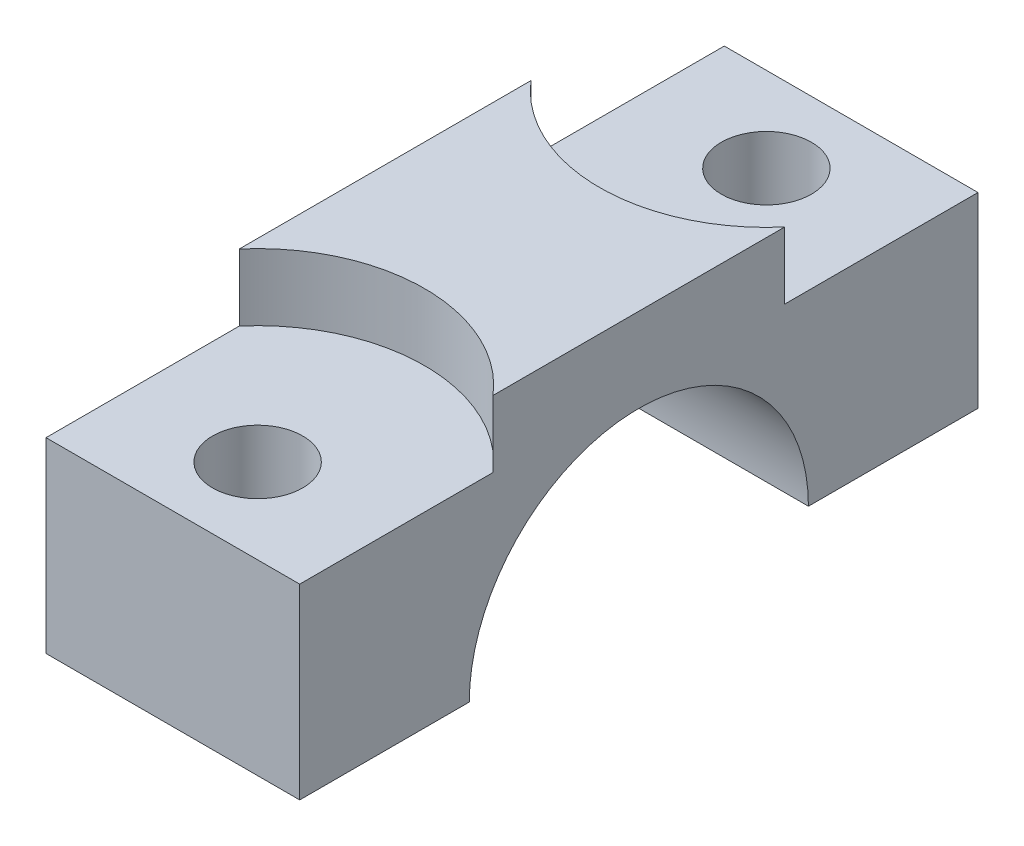
ISO-10303-21;
HEADER;
FILE_DESCRIPTION(('STEP AP214'),'2;1');
FILE_NAME('part.step','',(''),(''),'','','');
FILE_SCHEMA(('AUTOMOTIVE_DESIGN { 1 0 10303 214 1 1 1 1 }'));
ENDSEC;
DATA;
#1=APPLICATION_CONTEXT('core data for automotive mechanical design processes');
#2=APPLICATION_PROTOCOL_DEFINITION('international standard','automotive_design',2000,#1);
#3=PRODUCT_CONTEXT('',#1,'mechanical');
#4=PRODUCT('Part','Part','',(#3));
#5=PRODUCT_RELATED_PRODUCT_CATEGORY('part','',(#4));
#6=PRODUCT_DEFINITION_FORMATION('','',#4);
#7=PRODUCT_DEFINITION_CONTEXT('part definition',#1,'design');
#8=PRODUCT_DEFINITION('design','',#6,#7);
#9=PRODUCT_DEFINITION_SHAPE('','',#8);
#10=(LENGTH_UNIT() NAMED_UNIT(*) SI_UNIT(.MILLI.,.METRE.));
#11=(NAMED_UNIT(*) PLANE_ANGLE_UNIT() SI_UNIT($,.RADIAN.));
#12=(NAMED_UNIT(*) SI_UNIT($,.STERADIAN.) SOLID_ANGLE_UNIT());
#13=UNCERTAINTY_MEASURE_WITH_UNIT(LENGTH_MEASURE(1.E-05),#10,'distance_accuracy_value','');
#14=(GEOMETRIC_REPRESENTATION_CONTEXT(3) GLOBAL_UNCERTAINTY_ASSIGNED_CONTEXT((#13)) GLOBAL_UNIT_ASSIGNED_CONTEXT((#10,
#11,#12)) REPRESENTATION_CONTEXT('',''));
#15=CARTESIAN_POINT('',(0.,0.,0.));
#16=DIRECTION('',(0.,0.,1.));
#17=DIRECTION('',(1.,0.,0.));
#18=AXIS2_PLACEMENT_3D('',#15,#16,#17);
#19=CARTESIAN_POINT('',(9.5,19.,25.4));
#20=DIRECTION('',(0.,-1.,0.));
#21=DIRECTION('',(0.,0.,-1.));
#22=AXIS2_PLACEMENT_3D('',#19,#20,#21);
#23=PLANE('',#22);
#24=CARTESIAN_POINT('',(0.,19.,19.05));
#25=DIRECTION('',(0.,1.,0.));
#26=DIRECTION('',(0.,0.,1.));
#27=AXIS2_PLACEMENT_3D('',#24,#25,#26);
#28=CIRCLE('',#27,12.5);
#29=CARTESIAN_POINT('',(9.5,19.,10.925961595364));
#30=VERTEX_POINT('',#29);
#31=CARTESIAN_POINT('',(-9.5,19.,10.925961595364));
#32=VERTEX_POINT('',#31);
#33=EDGE_CURVE('E134',#30,#32,#28,.T.);
#34=ORIENTED_EDGE('',*,*,#33,.F.);
#35=DIRECTION('',(0.,0.,1.));
#36=VECTOR('',#35,1.);
#37=CARTESIAN_POINT('',(9.5,19.,25.4));
#38=LINE('',#37,#36);
#39=CARTESIAN_POINT('',(9.5,19.,-10.925961595364));
#40=VERTEX_POINT('',#39);
#41=EDGE_CURVE('E139',#40,#30,#38,.T.);
#42=ORIENTED_EDGE('',*,*,#41,.F.);
#43=CARTESIAN_POINT('',(0.,19.,-19.05));
#44=DIRECTION('',(0.,1.,0.));
#45=DIRECTION('',(0.,0.,1.));
#46=AXIS2_PLACEMENT_3D('',#43,#44,#45);
#47=CIRCLE('',#46,12.5);
#48=CARTESIAN_POINT('',(-9.5,19.,-10.925961595364));
#49=VERTEX_POINT('',#48);
#50=EDGE_CURVE('E65',#49,#40,#47,.T.);
#51=ORIENTED_EDGE('',*,*,#50,.F.);
#52=DIRECTION('',(0.,0.,1.));
#53=VECTOR('',#52,1.);
#54=CARTESIAN_POINT('',(-9.5,19.,25.4));
#55=LINE('',#54,#53);
#56=EDGE_CURVE('E173',#49,#32,#55,.T.);
#57=ORIENTED_EDGE('',*,*,#56,.T.);
#58=EDGE_LOOP('',(#34,#42,#51,#57));
#59=FACE_BOUND('',#58,.T.);
#60=ADVANCED_FACE('F42',(#59),#23,.F.);
#61=CARTESIAN_POINT('',(9.5,19.,25.4));
#62=DIRECTION('',(0.,0.,-1.));
#63=DIRECTION('',(0.,1.,0.));
#64=AXIS2_PLACEMENT_3D('',#61,#62,#63);
#65=PLANE('',#64);
#66=DIRECTION('',(0.,-1.,0.));
#67=VECTOR('',#66,1.);
#68=CARTESIAN_POINT('',(9.5,19.,25.4));
#69=LINE('',#68,#67);
#70=CARTESIAN_POINT('',(9.5,14.,25.4));
#71=VERTEX_POINT('',#70);
#72=CARTESIAN_POINT('',(9.5,0.,25.4));
#73=VERTEX_POINT('',#72);
#74=EDGE_CURVE('E169',#71,#73,#69,.T.);
#75=ORIENTED_EDGE('',*,*,#74,.F.);
#76=DIRECTION('',(-1.,0.,0.));
#77=VECTOR('',#76,1.);
#78=CARTESIAN_POINT('',(9.5,14.,25.4));
#79=LINE('',#78,#77);
#80=CARTESIAN_POINT('',(-9.5,14.,25.4));
#81=VERTEX_POINT('',#80);
#82=EDGE_CURVE('E120',#71,#81,#79,.T.);
#83=ORIENTED_EDGE('',*,*,#82,.T.);
#84=DIRECTION('',(0.,-1.,0.));
#85=VECTOR('',#84,1.);
#86=CARTESIAN_POINT('',(-9.5,19.,25.4));
#87=LINE('',#86,#85);
#88=CARTESIAN_POINT('',(-9.5,0.,25.4));
#89=VERTEX_POINT('',#88);
#90=EDGE_CURVE('E168',#81,#89,#87,.T.);
#91=ORIENTED_EDGE('',*,*,#90,.T.);
#92=DIRECTION('',(-1.,0.,0.));
#93=VECTOR('',#92,1.);
#94=CARTESIAN_POINT('',(9.5,0.,25.4));
#95=LINE('',#94,#93);
#96=EDGE_CURVE('E218',#73,#89,#95,.T.);
#97=ORIENTED_EDGE('',*,*,#96,.F.);
#98=EDGE_LOOP('',(#75,#83,#91,#97));
#99=FACE_BOUND('',#98,.T.);
#100=ADVANCED_FACE('F44',(#99),#65,.F.);
#101=CARTESIAN_POINT('',(9.5,0.,25.4));
#102=DIRECTION('',(0.,1.,0.));
#103=DIRECTION('',(0.,0.,1.));
#104=AXIS2_PLACEMENT_3D('',#101,#102,#103);
#105=PLANE('',#104);
#106=CARTESIAN_POINT('',(0.,0.,19.05));
#107=DIRECTION('',(0.,1.,0.));
#108=DIRECTION('',(0.,0.,1.));
#109=AXIS2_PLACEMENT_3D('',#106,#107,#108);
#110=CIRCLE('',#109,3.375);
#111=CARTESIAN_POINT('',(0.,0.,22.425));
#112=VERTEX_POINT('',#111);
#113=EDGE_CURVE('E235',#112,#112,#110,.T.);
#114=ORIENTED_EDGE('',*,*,#113,.T.);
#115=EDGE_LOOP('',(#114));
#116=FACE_BOUND('',#115,.T.);
#117=DIRECTION('',(0.,0.,-1.));
#118=VECTOR('',#117,1.);
#119=CARTESIAN_POINT('',(-9.5,0.,25.4));
#120=LINE('',#119,#118);
#121=CARTESIAN_POINT('',(-9.5,0.,12.7));
#122=VERTEX_POINT('',#121);
#123=EDGE_CURVE('E191',#89,#122,#120,.T.);
#124=ORIENTED_EDGE('',*,*,#123,.T.);
#125=DIRECTION('',(-1.,0.,0.));
#126=VECTOR('',#125,1.);
#127=CARTESIAN_POINT('',(9.5,0.,12.7));
#128=LINE('',#127,#126);
#129=CARTESIAN_POINT('',(9.5,0.,12.7));
#130=VERTEX_POINT('',#129);
#131=EDGE_CURVE('E214',#130,#122,#128,.T.);
#132=ORIENTED_EDGE('',*,*,#131,.F.);
#133=DIRECTION('',(0.,0.,-1.));
#134=VECTOR('',#133,1.);
#135=CARTESIAN_POINT('',(9.5,0.,25.4));
#136=LINE('',#135,#134);
#137=EDGE_CURVE('E172',#73,#130,#136,.T.);
#138=ORIENTED_EDGE('',*,*,#137,.F.);
#139=ORIENTED_EDGE('',*,*,#96,.T.);
#140=EDGE_LOOP('',(#124,#132,#138,#139));
#141=FACE_BOUND('',#140,.T.);
#142=ADVANCED_FACE('F242',(#116,#141),#105,.F.);
#143=CARTESIAN_POINT('',(9.5,0.,0.));
#144=DIRECTION('',(-1.,0.,0.));
#145=DIRECTION('',(0.,0.,1.));
#146=AXIS2_PLACEMENT_3D('',#143,#144,#145);
#147=CYLINDRICAL_SURFACE('',#146,12.7);
#148=CARTESIAN_POINT('',(-9.5,0.,0.));
#149=DIRECTION('',(-1.,0.,0.));
#150=DIRECTION('',(0.,0.,1.));
#151=AXIS2_PLACEMENT_3D('',#148,#149,#150);
#152=CIRCLE('',#151,12.7);
#153=CARTESIAN_POINT('',(-9.5,0.,-12.7));
#154=VERTEX_POINT('',#153);
#155=EDGE_CURVE('E194',#122,#154,#152,.T.);
#156=ORIENTED_EDGE('',*,*,#155,.T.);
#157=DIRECTION('',(-1.,0.,0.));
#158=VECTOR('',#157,1.);
#159=CARTESIAN_POINT('',(9.5,0.,-12.7));
#160=LINE('',#159,#158);
#161=CARTESIAN_POINT('',(9.5,0.,-12.7));
#162=VERTEX_POINT('',#161);
#163=EDGE_CURVE('E210',#162,#154,#160,.T.);
#164=ORIENTED_EDGE('',*,*,#163,.F.);
#165=CARTESIAN_POINT('',(9.5,0.,0.));
#166=DIRECTION('',(-1.,0.,0.));
#167=DIRECTION('',(0.,0.,1.));
#168=AXIS2_PLACEMENT_3D('',#165,#166,#167);
#169=CIRCLE('',#168,12.7);
#170=EDGE_CURVE('E176',#130,#162,#169,.T.);
#171=ORIENTED_EDGE('',*,*,#170,.F.);
#172=ORIENTED_EDGE('',*,*,#131,.T.);
#173=EDGE_LOOP('',(#156,#164,#171,#172));
#174=FACE_BOUND('',#173,.T.);
#175=ADVANCED_FACE('F248',(#174),#147,.F.);
#176=CARTESIAN_POINT('',(9.5,0.,-12.7));
#177=DIRECTION('',(0.,1.,0.));
#178=DIRECTION('',(0.,0.,1.));
#179=AXIS2_PLACEMENT_3D('',#176,#177,#178);
#180=PLANE('',#179);
#181=CARTESIAN_POINT('',(0.,0.,-19.05));
#182=DIRECTION('',(0.,1.,0.));
#183=DIRECTION('',(0.,0.,1.));
#184=AXIS2_PLACEMENT_3D('',#181,#182,#183);
#185=CIRCLE('',#184,3.375);
#186=CARTESIAN_POINT('',(0.,0.,-15.675));
#187=VERTEX_POINT('',#186);
#188=EDGE_CURVE('E154',#187,#187,#185,.T.);
#189=ORIENTED_EDGE('',*,*,#188,.T.);
#190=EDGE_LOOP('',(#189));
#191=FACE_BOUND('',#190,.T.);
#192=DIRECTION('',(0.,0.,-1.));
#193=VECTOR('',#192,1.);
#194=CARTESIAN_POINT('',(-9.5,0.,-12.7));
#195=LINE('',#194,#193);
#196=CARTESIAN_POINT('',(-9.5,0.,-25.4));
#197=VERTEX_POINT('',#196);
#198=EDGE_CURVE('E197',#154,#197,#195,.T.);
#199=ORIENTED_EDGE('',*,*,#198,.T.);
#200=DIRECTION('',(-1.,0.,0.));
#201=VECTOR('',#200,1.);
#202=CARTESIAN_POINT('',(9.5,0.,-25.4));
#203=LINE('',#202,#201);
#204=CARTESIAN_POINT('',(9.5,0.,-25.4));
#205=VERTEX_POINT('',#204);
#206=EDGE_CURVE('E188',#205,#197,#203,.T.);
#207=ORIENTED_EDGE('',*,*,#206,.F.);
#208=DIRECTION('',(0.,0.,-1.));
#209=VECTOR('',#208,1.);
#210=CARTESIAN_POINT('',(9.5,0.,-12.7));
#211=LINE('',#210,#209);
#212=EDGE_CURVE('E179',#162,#205,#211,.T.);
#213=ORIENTED_EDGE('',*,*,#212,.F.);
#214=ORIENTED_EDGE('',*,*,#163,.T.);
#215=EDGE_LOOP('',(#199,#207,#213,#214));
#216=FACE_BOUND('',#215,.T.);
#217=ADVANCED_FACE('F250',(#191,#216),#180,.F.);
#218=CARTESIAN_POINT('',(9.5,19.,-25.4));
#219=DIRECTION('',(0.,0.,1.));
#220=DIRECTION('',(0.,-1.,0.));
#221=AXIS2_PLACEMENT_3D('',#218,#219,#220);
#222=PLANE('',#221);
#223=DIRECTION('',(0.,1.,0.));
#224=VECTOR('',#223,1.);
#225=CARTESIAN_POINT('',(-9.5,19.,-25.4));
#226=LINE('',#225,#224);
#227=CARTESIAN_POINT('',(-9.5,14.,-25.4));
#228=VERTEX_POINT('',#227);
#229=EDGE_CURVE('E200',#197,#228,#226,.T.);
#230=ORIENTED_EDGE('',*,*,#229,.T.);
#231=DIRECTION('',(1.,0.,0.));
#232=VECTOR('',#231,1.);
#233=CARTESIAN_POINT('',(9.5,14.,-25.4));
#234=LINE('',#233,#232);
#235=CARTESIAN_POINT('',(9.5,14.,-25.4));
#236=VERTEX_POINT('',#235);
#237=EDGE_CURVE('E161',#228,#236,#234,.T.);
#238=ORIENTED_EDGE('',*,*,#237,.T.);
#239=DIRECTION('',(0.,1.,0.));
#240=VECTOR('',#239,1.);
#241=CARTESIAN_POINT('',(9.5,19.,-25.4));
#242=LINE('',#241,#240);
#243=EDGE_CURVE('E182',#205,#236,#242,.T.);
#244=ORIENTED_EDGE('',*,*,#243,.F.);
#245=ORIENTED_EDGE('',*,*,#206,.T.);
#246=EDGE_LOOP('',(#230,#238,#244,#245));
#247=FACE_BOUND('',#246,.T.);
#248=ADVANCED_FACE('F254',(#247),#222,.F.);
#249=CARTESIAN_POINT('',(9.5,0.,0.));
#250=DIRECTION('',(-1.,0.,0.));
#251=DIRECTION('',(0.,0.,1.));
#252=AXIS2_PLACEMENT_3D('',#249,#250,#251);
#253=PLANE('',#252);
#254=DIRECTION('',(0.,1.,0.));
#255=VECTOR('',#254,1.);
#256=CARTESIAN_POINT('',(9.5,19.,10.925961595364));
#257=LINE('',#256,#255);
#258=CARTESIAN_POINT('',(9.5,14.,10.925961595364));
#259=VERTEX_POINT('',#258);
#260=EDGE_CURVE('E125',#30,#259,#257,.F.);
#261=ORIENTED_EDGE('',*,*,#260,.T.);
#262=DIRECTION('',(0.,0.,1.));
#263=VECTOR('',#262,1.);
#264=CARTESIAN_POINT('',(9.5,14.,0.));
#265=LINE('',#264,#263);
#266=EDGE_CURVE('E117',#259,#71,#265,.T.);
#267=ORIENTED_EDGE('',*,*,#266,.T.);
#268=ORIENTED_EDGE('',*,*,#74,.T.);
#269=ORIENTED_EDGE('',*,*,#137,.T.);
#270=ORIENTED_EDGE('',*,*,#170,.T.);
#271=ORIENTED_EDGE('',*,*,#212,.T.);
#272=ORIENTED_EDGE('',*,*,#243,.T.);
#273=DIRECTION('',(0.,0.,1.));
#274=VECTOR('',#273,1.);
#275=CARTESIAN_POINT('',(9.5,14.,0.));
#276=LINE('',#275,#274);
#277=CARTESIAN_POINT('',(9.5,14.,-10.925961595364));
#278=VERTEX_POINT('',#277);
#279=EDGE_CURVE('E225',#236,#278,#276,.T.);
#280=ORIENTED_EDGE('',*,*,#279,.T.);
#281=DIRECTION('',(0.,1.,0.));
#282=VECTOR('',#281,1.);
#283=CARTESIAN_POINT('',(9.5,19.,-10.925961595364));
#284=LINE('',#283,#282);
#285=EDGE_CURVE('E222',#278,#40,#284,.T.);
#286=ORIENTED_EDGE('',*,*,#285,.T.);
#287=ORIENTED_EDGE('',*,*,#41,.T.);
#288=EDGE_LOOP('',(#261,#267,#268,#269,#270,#271,#272,#280,#286,#287));
#289=FACE_BOUND('',#288,.T.);
#290=ADVANCED_FACE('F137',(#289),#253,.F.);
#291=CARTESIAN_POINT('',(-9.5,0.,0.));
#292=DIRECTION('',(-1.,0.,0.));
#293=DIRECTION('',(0.,0.,1.));
#294=AXIS2_PLACEMENT_3D('',#291,#292,#293);
#295=PLANE('',#294);
#296=DIRECTION('',(0.,1.,0.));
#297=VECTOR('',#296,1.);
#298=CARTESIAN_POINT('',(-9.5,19.,10.925961595364));
#299=LINE('',#298,#297);
#300=CARTESIAN_POINT('',(-9.5,14.,10.925961595364));
#301=VERTEX_POINT('',#300);
#302=EDGE_CURVE('E11',#32,#301,#299,.F.);
#303=ORIENTED_EDGE('',*,*,#302,.F.);
#304=ORIENTED_EDGE('',*,*,#56,.F.);
#305=DIRECTION('',(0.,1.,0.));
#306=VECTOR('',#305,1.);
#307=CARTESIAN_POINT('',(-9.5,19.,-10.925961595364));
#308=LINE('',#307,#306);
#309=CARTESIAN_POINT('',(-9.5,14.,-10.925961595364));
#310=VERTEX_POINT('',#309);
#311=EDGE_CURVE('E158',#310,#49,#308,.T.);
#312=ORIENTED_EDGE('',*,*,#311,.F.);
#313=DIRECTION('',(0.,0.,1.));
#314=VECTOR('',#313,1.);
#315=CARTESIAN_POINT('',(-9.5,14.,0.));
#316=LINE('',#315,#314);
#317=EDGE_CURVE('E165',#228,#310,#316,.T.);
#318=ORIENTED_EDGE('',*,*,#317,.F.);
#319=ORIENTED_EDGE('',*,*,#229,.F.);
#320=ORIENTED_EDGE('',*,*,#198,.F.);
#321=ORIENTED_EDGE('',*,*,#155,.F.);
#322=ORIENTED_EDGE('',*,*,#123,.F.);
#323=ORIENTED_EDGE('',*,*,#90,.F.);
#324=DIRECTION('',(0.,0.,1.));
#325=VECTOR('',#324,1.);
#326=CARTESIAN_POINT('',(-9.5,14.,0.));
#327=LINE('',#326,#325);
#328=EDGE_CURVE('E51',#301,#81,#327,.T.);
#329=ORIENTED_EDGE('',*,*,#328,.F.);
#330=EDGE_LOOP('',(#303,#304,#312,#318,#319,#320,#321,#322,#323,#329));
#331=FACE_BOUND('',#330,.T.);
#332=ADVANCED_FACE('F236',(#331),#295,.T.);
#333=CARTESIAN_POINT('',(0.,19.,-19.05));
#334=DIRECTION('',(0.,1.,0.));
#335=DIRECTION('',(0.,0.,1.));
#336=AXIS2_PLACEMENT_3D('',#333,#334,#335);
#337=CYLINDRICAL_SURFACE('',#336,3.375);
#338=ORIENTED_EDGE('',*,*,#188,.F.);
#339=EDGE_LOOP('',(#338));
#340=FACE_BOUND('',#339,.T.);
#341=CARTESIAN_POINT('',(0.,14.,-19.05));
#342=DIRECTION('',(0.,1.,0.));
#343=DIRECTION('',(0.,0.,1.));
#344=AXIS2_PLACEMENT_3D('',#341,#342,#343);
#345=CIRCLE('',#344,3.37500000000001);
#346=CARTESIAN_POINT('',(0.,14.,-15.675));
#347=VERTEX_POINT('',#346);
#348=EDGE_CURVE('E150',#347,#347,#345,.T.);
#349=ORIENTED_EDGE('',*,*,#348,.T.);
#350=EDGE_LOOP('',(#349));
#351=FACE_BOUND('',#350,.T.);
#352=ADVANCED_FACE('F329',(#340,#351),#337,.F.);
#353=CARTESIAN_POINT('',(3.37500000000001,14.,-19.05));
#354=DIRECTION('',(0.,-1.,0.));
#355=DIRECTION('',(0.,0.,-1.));
#356=AXIS2_PLACEMENT_3D('',#353,#354,#355);
#357=PLANE('',#356);
#358=ORIENTED_EDGE('',*,*,#317,.T.);
#359=CARTESIAN_POINT('',(0.,14.,-19.05));
#360=DIRECTION('',(0.,1.,0.));
#361=DIRECTION('',(0.,0.,1.));
#362=AXIS2_PLACEMENT_3D('',#359,#360,#361);
#363=CIRCLE('',#362,12.5);
#364=EDGE_CURVE('E143',#310,#278,#363,.T.);
#365=ORIENTED_EDGE('',*,*,#364,.T.);
#366=ORIENTED_EDGE('',*,*,#279,.F.);
#367=ORIENTED_EDGE('',*,*,#237,.F.);
#368=EDGE_LOOP('',(#358,#365,#366,#367));
#369=FACE_BOUND('',#368,.T.);
#370=ORIENTED_EDGE('',*,*,#348,.F.);
#371=EDGE_LOOP('',(#370));
#372=FACE_BOUND('',#371,.T.);
#373=ADVANCED_FACE('F256',(#369,#372),#357,.F.);
#374=CARTESIAN_POINT('',(0.,19.,-19.05));
#375=DIRECTION('',(0.,1.,0.));
#376=DIRECTION('',(0.,0.,1.));
#377=AXIS2_PLACEMENT_3D('',#374,#375,#376);
#378=CYLINDRICAL_SURFACE('',#377,12.5);
#379=ORIENTED_EDGE('',*,*,#311,.T.);
#380=ORIENTED_EDGE('',*,*,#50,.T.);
#381=ORIENTED_EDGE('',*,*,#285,.F.);
#382=ORIENTED_EDGE('',*,*,#364,.F.);
#383=EDGE_LOOP('',(#379,#380,#381,#382));
#384=FACE_BOUND('',#383,.T.);
#385=ADVANCED_FACE('F261',(#384),#378,.F.);
#386=CARTESIAN_POINT('',(0.,19.,19.05));
#387=DIRECTION('',(0.,1.,0.));
#388=DIRECTION('',(0.,0.,1.));
#389=AXIS2_PLACEMENT_3D('',#386,#387,#388);
#390=CYLINDRICAL_SURFACE('',#389,12.5);
#391=ORIENTED_EDGE('',*,*,#33,.T.);
#392=ORIENTED_EDGE('',*,*,#302,.T.);
#393=CARTESIAN_POINT('',(0.,14.,19.05));
#394=DIRECTION('',(0.,1.,0.));
#395=DIRECTION('',(0.,0.,1.));
#396=AXIS2_PLACEMENT_3D('',#393,#394,#395);
#397=CIRCLE('',#396,12.5);
#398=EDGE_CURVE('E58',#259,#301,#397,.T.);
#399=ORIENTED_EDGE('',*,*,#398,.F.);
#400=ORIENTED_EDGE('',*,*,#260,.F.);
#401=EDGE_LOOP('',(#391,#392,#399,#400));
#402=FACE_BOUND('',#401,.T.);
#403=ADVANCED_FACE('F128',(#402),#390,.F.);
#404=CARTESIAN_POINT('',(3.37500000000001,14.,19.05));
#405=DIRECTION('',(0.,-1.,0.));
#406=DIRECTION('',(0.,0.,-1.));
#407=AXIS2_PLACEMENT_3D('',#404,#405,#406);
#408=PLANE('',#407);
#409=CARTESIAN_POINT('',(0.,14.,19.05));
#410=DIRECTION('',(0.,1.,0.));
#411=DIRECTION('',(0.,0.,1.));
#412=AXIS2_PLACEMENT_3D('',#409,#410,#411);
#413=CIRCLE('',#412,3.37500000000001);
#414=CARTESIAN_POINT('',(0.,14.,22.425));
#415=VERTEX_POINT('',#414);
#416=EDGE_CURVE('E133',#415,#415,#413,.T.);
#417=ORIENTED_EDGE('',*,*,#416,.F.);
#418=EDGE_LOOP('',(#417));
#419=FACE_BOUND('',#418,.T.);
#420=ORIENTED_EDGE('',*,*,#398,.T.);
#421=ORIENTED_EDGE('',*,*,#328,.T.);
#422=ORIENTED_EDGE('',*,*,#82,.F.);
#423=ORIENTED_EDGE('',*,*,#266,.F.);
#424=EDGE_LOOP('',(#420,#421,#422,#423));
#425=FACE_BOUND('',#424,.T.);
#426=ADVANCED_FACE('F118',(#419,#425),#408,.F.);
#427=CARTESIAN_POINT('',(0.,19.,19.05));
#428=DIRECTION('',(0.,1.,0.));
#429=DIRECTION('',(0.,0.,1.));
#430=AXIS2_PLACEMENT_3D('',#427,#428,#429);
#431=CYLINDRICAL_SURFACE('',#430,3.375);
#432=ORIENTED_EDGE('',*,*,#113,.F.);
#433=EDGE_LOOP('',(#432));
#434=FACE_BOUND('',#433,.T.);
#435=ORIENTED_EDGE('',*,*,#416,.T.);
#436=EDGE_LOOP('',(#435));
#437=FACE_BOUND('',#436,.T.);
#438=ADVANCED_FACE('F275',(#434,#437),#431,.F.);
#439=CLOSED_SHELL('',(#60,#100,#142,#175,#217,#248,#290,#332,#352,#373,#385,#403,#426,#438));
#440=MANIFOLD_SOLID_BREP('B2',#439);
#441=ADVANCED_BREP_SHAPE_REPRESENTATION('',(#18,#440),#14);
#442=SHAPE_DEFINITION_REPRESENTATION(#9,#441);
ENDSEC;
END-ISO-10303-21;
